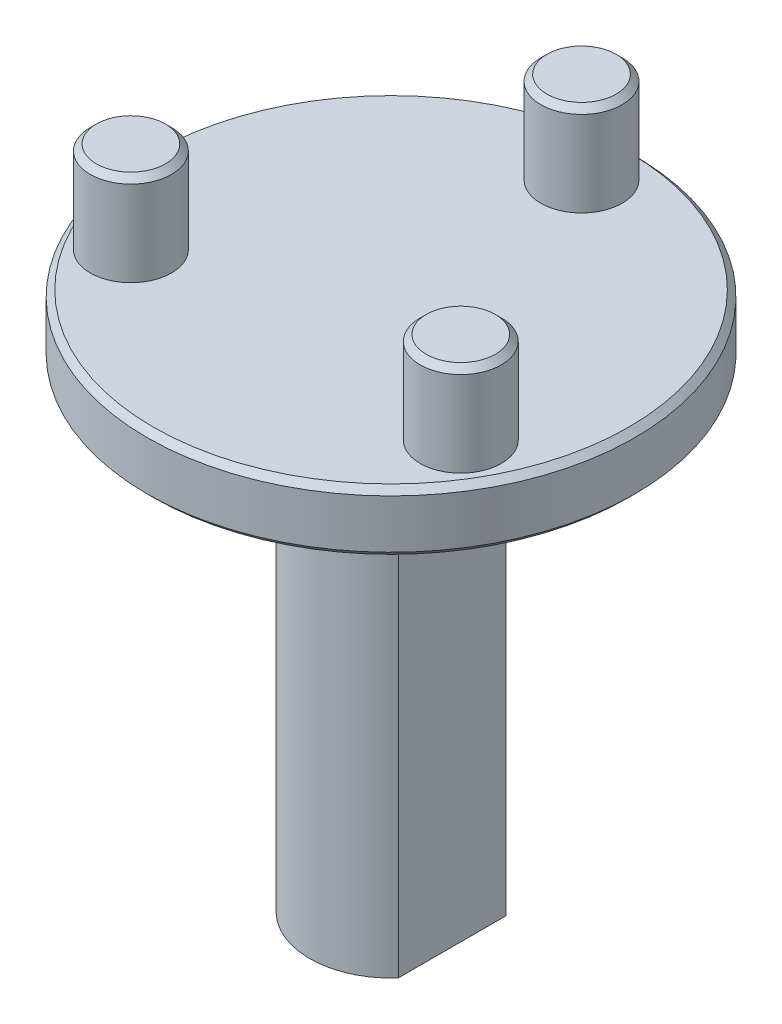
ISO-10303-21;
HEADER;
FILE_DESCRIPTION(('STEP AP214'),'2;1');
FILE_NAME('part.step','',(''),(''),'','','');
FILE_SCHEMA(('AUTOMOTIVE_DESIGN { 1 0 10303 214 1 1 1 1 }'));
ENDSEC;
DATA;
#1=APPLICATION_CONTEXT('core data for automotive mechanical design processes');
#2=APPLICATION_PROTOCOL_DEFINITION('international standard','automotive_design',2000,#1);
#3=PRODUCT_CONTEXT('',#1,'mechanical');
#4=PRODUCT('Part','Part','',(#3));
#5=PRODUCT_RELATED_PRODUCT_CATEGORY('part','',(#4));
#6=PRODUCT_DEFINITION_FORMATION('','',#4);
#7=PRODUCT_DEFINITION_CONTEXT('part definition',#1,'design');
#8=PRODUCT_DEFINITION('design','',#6,#7);
#9=PRODUCT_DEFINITION_SHAPE('','',#8);
#10=(LENGTH_UNIT() NAMED_UNIT(*) SI_UNIT(.MILLI.,.METRE.));
#11=(NAMED_UNIT(*) PLANE_ANGLE_UNIT() SI_UNIT($,.RADIAN.));
#12=(NAMED_UNIT(*) SI_UNIT($,.STERADIAN.) SOLID_ANGLE_UNIT());
#13=UNCERTAINTY_MEASURE_WITH_UNIT(LENGTH_MEASURE(1.E-05),#10,'distance_accuracy_value','');
#14=(GEOMETRIC_REPRESENTATION_CONTEXT(3) GLOBAL_UNCERTAINTY_ASSIGNED_CONTEXT((#13)) GLOBAL_UNIT_ASSIGNED_CONTEXT((#10,
#11,#12)) REPRESENTATION_CONTEXT('',''));
#15=CARTESIAN_POINT('',(0.,0.,0.));
#16=DIRECTION('',(0.,0.,1.));
#17=DIRECTION('',(1.,0.,0.));
#18=AXIS2_PLACEMENT_3D('',#15,#16,#17);
#19=CARTESIAN_POINT('',(0.,3.,0.));
#20=DIRECTION('',(0.,-1.,0.));
#21=DIRECTION('',(0.,0.,-1.));
#22=AXIS2_PLACEMENT_3D('',#19,#20,#21);
#23=CYLINDRICAL_SURFACE('',#22,12.);
#24=CARTESIAN_POINT('',(0.,0.299999999999998,0.));
#25=DIRECTION('',(0.,1.,0.));
#26=DIRECTION('',(0.,0.,1.));
#27=AXIS2_PLACEMENT_3D('',#24,#25,#26);
#28=CIRCLE('',#27,12.);
#29=CARTESIAN_POINT('',(0.,0.299999999999998,12.));
#30=VERTEX_POINT('',#29);
#31=EDGE_CURVE('E110',#30,#30,#28,.T.);
#32=ORIENTED_EDGE('',*,*,#31,.T.);
#33=EDGE_LOOP('',(#32));
#34=FACE_BOUND('',#33,.T.);
#35=CARTESIAN_POINT('',(0.,2.7,0.));
#36=DIRECTION('',(0.,1.,0.));
#37=DIRECTION('',(0.,0.,1.));
#38=AXIS2_PLACEMENT_3D('',#35,#36,#37);
#39=CIRCLE('',#38,12.);
#40=CARTESIAN_POINT('',(0.,2.7,12.));
#41=VERTEX_POINT('',#40);
#42=EDGE_CURVE('E107',#41,#41,#39,.F.);
#43=ORIENTED_EDGE('',*,*,#42,.T.);
#44=EDGE_LOOP('',(#43));
#45=FACE_BOUND('',#44,.T.);
#46=ADVANCED_FACE('F39',(#34,#45),#23,.T.);
#47=CARTESIAN_POINT('',(0.,3.,0.));
#48=DIRECTION('',(0.,1.,0.));
#49=DIRECTION('',(0.,0.,1.));
#50=AXIS2_PLACEMENT_3D('',#47,#48,#49);
#51=PLANE('',#50);
#52=CARTESIAN_POINT('',(0.,3.,0.));
#53=DIRECTION('',(0.,1.,0.));
#54=DIRECTION('',(0.,0.,1.));
#55=AXIS2_PLACEMENT_3D('',#52,#53,#54);
#56=CIRCLE('',#55,11.7);
#57=CARTESIAN_POINT('',(0.,3.,11.7));
#58=VERTEX_POINT('',#57);
#59=EDGE_CURVE('E116',#58,#58,#56,.T.);
#60=ORIENTED_EDGE('',*,*,#59,.T.);
#61=EDGE_LOOP('',(#60));
#62=FACE_BOUND('',#61,.T.);
#63=CARTESIAN_POINT('',(8.1146580334602,3.,4.68499999999998));
#64=DIRECTION('',(0.,1.,0.));
#65=DIRECTION('',(0.,0.,1.));
#66=AXIS2_PLACEMENT_3D('',#63,#64,#65);
#67=CIRCLE('',#66,2.);
#68=CARTESIAN_POINT('',(8.1146580334602,3.,6.68499999999998));
#69=VERTEX_POINT('',#68);
#70=EDGE_CURVE('E89',#69,#69,#67,.T.);
#71=ORIENTED_EDGE('',*,*,#70,.F.);
#72=EDGE_LOOP('',(#71));
#73=FACE_BOUND('',#72,.T.);
#74=CARTESIAN_POINT('',(-8.1146580334602,3.,4.68499999999998));
#75=DIRECTION('',(0.,1.,0.));
#76=DIRECTION('',(0.,0.,1.));
#77=AXIS2_PLACEMENT_3D('',#74,#75,#76);
#78=CIRCLE('',#77,2.);
#79=CARTESIAN_POINT('',(-8.1146580334602,3.,6.68499999999998));
#80=VERTEX_POINT('',#79);
#81=EDGE_CURVE('E97',#80,#80,#78,.T.);
#82=ORIENTED_EDGE('',*,*,#81,.F.);
#83=EDGE_LOOP('',(#82));
#84=FACE_BOUND('',#83,.T.);
#85=CARTESIAN_POINT('',(0.,3.,-9.37));
#86=DIRECTION('',(0.,1.,0.));
#87=DIRECTION('',(0.,0.,1.));
#88=AXIS2_PLACEMENT_3D('',#85,#86,#87);
#89=CIRCLE('',#88,2.);
#90=CARTESIAN_POINT('',(0.,3.,-7.37));
#91=VERTEX_POINT('',#90);
#92=EDGE_CURVE('E94',#91,#91,#89,.T.);
#93=ORIENTED_EDGE('',*,*,#92,.F.);
#94=EDGE_LOOP('',(#93));
#95=FACE_BOUND('',#94,.T.);
#96=ADVANCED_FACE('F139',(#62,#73,#84,#95),#51,.T.);
#97=CARTESIAN_POINT('',(0.,0.,0.));
#98=DIRECTION('',(0.,1.,0.));
#99=DIRECTION('',(0.,0.,1.));
#100=AXIS2_PLACEMENT_3D('',#97,#98,#99);
#101=PLANE('',#100);
#102=CARTESIAN_POINT('',(0.,0.,0.));
#103=DIRECTION('',(0.,1.,0.));
#104=DIRECTION('',(0.,0.,1.));
#105=AXIS2_PLACEMENT_3D('',#102,#103,#104);
#106=CIRCLE('',#105,11.7);
#107=CARTESIAN_POINT('',(0.,0.,11.7));
#108=VERTEX_POINT('',#107);
#109=EDGE_CURVE('E113',#108,#108,#106,.F.);
#110=ORIENTED_EDGE('',*,*,#109,.T.);
#111=EDGE_LOOP('',(#110));
#112=FACE_BOUND('',#111,.T.);
#113=CARTESIAN_POINT('',(0.,0.,0.));
#114=DIRECTION('',(0.,-1.,0.));
#115=DIRECTION('',(0.,0.,-1.));
#116=AXIS2_PLACEMENT_3D('',#113,#114,#115);
#117=CIRCLE('',#116,5.);
#118=CARTESIAN_POINT('',(0.,0.,-5.));
#119=VERTEX_POINT('',#118);
#120=EDGE_CURVE('E90',#119,#119,#117,.T.);
#121=ORIENTED_EDGE('',*,*,#120,.F.);
#122=EDGE_LOOP('',(#121));
#123=FACE_BOUND('',#122,.T.);
#124=ADVANCED_FACE('F145',(#112,#123),#101,.F.);
#125=CARTESIAN_POINT('',(0.,7.5,-9.37));
#126=DIRECTION('',(0.,-1.,0.));
#127=DIRECTION('',(0.,0.,-1.));
#128=AXIS2_PLACEMENT_3D('',#125,#126,#127);
#129=CYLINDRICAL_SURFACE('',#128,2.);
#130=CARTESIAN_POINT('',(0.,7.19999999999999,-9.37));
#131=DIRECTION('',(0.,1.,0.));
#132=DIRECTION('',(0.,0.,1.));
#133=AXIS2_PLACEMENT_3D('',#130,#131,#132);
#134=CIRCLE('',#133,2.);
#135=CARTESIAN_POINT('',(0.,7.19999999999999,-7.37));
#136=VERTEX_POINT('',#135);
#137=EDGE_CURVE('E122',#136,#136,#134,.F.);
#138=ORIENTED_EDGE('',*,*,#137,.T.);
#139=EDGE_LOOP('',(#138));
#140=FACE_BOUND('',#139,.T.);
#141=ORIENTED_EDGE('',*,*,#92,.T.);
#142=EDGE_LOOP('',(#141));
#143=FACE_BOUND('',#142,.T.);
#144=ADVANCED_FACE('F188',(#140,#143),#129,.T.);
#145=CARTESIAN_POINT('',(0.,7.5,-9.37));
#146=DIRECTION('',(0.,1.,0.));
#147=DIRECTION('',(0.,0.,1.));
#148=AXIS2_PLACEMENT_3D('',#145,#146,#147);
#149=PLANE('',#148);
#150=CARTESIAN_POINT('',(0.,7.5,-9.37));
#151=DIRECTION('',(0.,1.,0.));
#152=DIRECTION('',(0.,0.,1.));
#153=AXIS2_PLACEMENT_3D('',#150,#151,#152);
#154=CIRCLE('',#153,1.69999999999999);
#155=CARTESIAN_POINT('',(0.,7.5,-7.67000000000001));
#156=VERTEX_POINT('',#155);
#157=EDGE_CURVE('E119',#156,#156,#154,.T.);
#158=ORIENTED_EDGE('',*,*,#157,.T.);
#159=EDGE_LOOP('',(#158));
#160=FACE_BOUND('',#159,.T.);
#161=ADVANCED_FACE('F190',(#160),#149,.T.);
#162=CARTESIAN_POINT('',(-8.1146580334602,7.5,4.68499999999998));
#163=DIRECTION('',(0.,-1.,0.));
#164=DIRECTION('',(0.,0.,-1.));
#165=AXIS2_PLACEMENT_3D('',#162,#163,#164);
#166=CYLINDRICAL_SURFACE('',#165,2.);
#167=CARTESIAN_POINT('',(-8.1146580334602,7.2,4.68499999999998));
#168=DIRECTION('',(0.,1.,0.));
#169=DIRECTION('',(0.,0.,1.));
#170=AXIS2_PLACEMENT_3D('',#167,#168,#169);
#171=CIRCLE('',#170,2.);
#172=CARTESIAN_POINT('',(-8.1146580334602,7.2,6.68499999999998));
#173=VERTEX_POINT('',#172);
#174=EDGE_CURVE('E104',#173,#173,#171,.F.);
#175=ORIENTED_EDGE('',*,*,#174,.T.);
#176=EDGE_LOOP('',(#175));
#177=FACE_BOUND('',#176,.T.);
#178=ORIENTED_EDGE('',*,*,#81,.T.);
#179=EDGE_LOOP('',(#178));
#180=FACE_BOUND('',#179,.T.);
#181=ADVANCED_FACE('F197',(#177,#180),#166,.T.);
#182=CARTESIAN_POINT('',(-8.1146580334602,7.5,4.68499999999998));
#183=DIRECTION('',(0.,1.,0.));
#184=DIRECTION('',(0.,0.,1.));
#185=AXIS2_PLACEMENT_3D('',#182,#183,#184);
#186=PLANE('',#185);
#187=CARTESIAN_POINT('',(-8.1146580334602,7.5,4.68499999999998));
#188=DIRECTION('',(0.,1.,0.));
#189=DIRECTION('',(0.,0.,1.));
#190=AXIS2_PLACEMENT_3D('',#187,#188,#189);
#191=CIRCLE('',#190,1.70000000000001);
#192=CARTESIAN_POINT('',(-8.1146580334602,7.5,6.38499999999999));
#193=VERTEX_POINT('',#192);
#194=EDGE_CURVE('E93',#193,#193,#191,.T.);
#195=ORIENTED_EDGE('',*,*,#194,.T.);
#196=EDGE_LOOP('',(#195));
#197=FACE_BOUND('',#196,.T.);
#198=ADVANCED_FACE('F202',(#197),#186,.T.);
#199=CARTESIAN_POINT('',(8.1146580334602,7.5,4.68499999999998));
#200=DIRECTION('',(0.,-1.,0.));
#201=DIRECTION('',(0.,0.,-1.));
#202=AXIS2_PLACEMENT_3D('',#199,#200,#201);
#203=CYLINDRICAL_SURFACE('',#202,2.);
#204=CARTESIAN_POINT('',(8.1146580334602,7.2,4.68499999999998));
#205=DIRECTION('',(0.,1.,0.));
#206=DIRECTION('',(0.,0.,1.));
#207=AXIS2_PLACEMENT_3D('',#204,#205,#206);
#208=CIRCLE('',#207,2.);
#209=CARTESIAN_POINT('',(8.1146580334602,7.2,6.68499999999998));
#210=VERTEX_POINT('',#209);
#211=EDGE_CURVE('E11',#210,#210,#208,.F.);
#212=ORIENTED_EDGE('',*,*,#211,.T.);
#213=EDGE_LOOP('',(#212));
#214=FACE_BOUND('',#213,.T.);
#215=ORIENTED_EDGE('',*,*,#70,.T.);
#216=EDGE_LOOP('',(#215));
#217=FACE_BOUND('',#216,.T.);
#218=ADVANCED_FACE('F205',(#214,#217),#203,.T.);
#219=CARTESIAN_POINT('',(8.1146580334602,7.5,4.68499999999998));
#220=DIRECTION('',(0.,1.,0.));
#221=DIRECTION('',(0.,0.,1.));
#222=AXIS2_PLACEMENT_3D('',#219,#220,#221);
#223=PLANE('',#222);
#224=CARTESIAN_POINT('',(8.1146580334602,7.5,4.68499999999998));
#225=DIRECTION('',(0.,1.,0.));
#226=DIRECTION('',(0.,0.,1.));
#227=AXIS2_PLACEMENT_3D('',#224,#225,#226);
#228=CIRCLE('',#227,1.70000000000001);
#229=CARTESIAN_POINT('',(8.1146580334602,7.5,6.38499999999999));
#230=VERTEX_POINT('',#229);
#231=EDGE_CURVE('E48',#230,#230,#228,.T.);
#232=ORIENTED_EDGE('',*,*,#231,.T.);
#233=EDGE_LOOP('',(#232));
#234=FACE_BOUND('',#233,.T.);
#235=ADVANCED_FACE('F127',(#234),#223,.T.);
#236=CARTESIAN_POINT('',(0.,-1.,0.));
#237=DIRECTION('',(0.,1.,0.));
#238=DIRECTION('',(0.,0.,1.));
#239=AXIS2_PLACEMENT_3D('',#236,#237,#238);
#240=CYLINDRICAL_SURFACE('',#239,5.);
#241=CARTESIAN_POINT('',(0.,-1.,0.));
#242=DIRECTION('',(0.,-1.,0.));
#243=DIRECTION('',(0.,0.,-1.));
#244=AXIS2_PLACEMENT_3D('',#241,#242,#243);
#245=CIRCLE('',#244,5.);
#246=CARTESIAN_POINT('',(0.,-1.,-5.));
#247=VERTEX_POINT('',#246);
#248=EDGE_CURVE('E83',#247,#247,#245,.T.);
#249=ORIENTED_EDGE('',*,*,#248,.F.);
#250=EDGE_LOOP('',(#249));
#251=FACE_BOUND('',#250,.T.);
#252=ORIENTED_EDGE('',*,*,#120,.T.);
#253=EDGE_LOOP('',(#252));
#254=FACE_BOUND('',#253,.T.);
#255=ADVANCED_FACE('F212',(#251,#254),#240,.T.);
#256=CARTESIAN_POINT('',(0.,-1.,0.));
#257=DIRECTION('',(0.,-1.,0.));
#258=DIRECTION('',(0.,0.,-1.));
#259=AXIS2_PLACEMENT_3D('',#256,#257,#258);
#260=PLANE('',#259);
#261=CARTESIAN_POINT('',(0.,-1.,0.));
#262=DIRECTION('',(0.,-1.,0.));
#263=DIRECTION('',(0.,0.,-1.));
#264=AXIS2_PLACEMENT_3D('',#261,#262,#263);
#265=CIRCLE('',#264,4.);
#266=CARTESIAN_POINT('',(3.,-1.,2.64575131106459));
#267=VERTEX_POINT('',#266);
#268=CARTESIAN_POINT('',(3.,-1.,-2.64575131106459));
#269=VERTEX_POINT('',#268);
#270=EDGE_CURVE('E67',#267,#269,#265,.T.);
#271=ORIENTED_EDGE('',*,*,#270,.F.);
#272=DIRECTION('',(0.,0.,1.));
#273=VECTOR('',#272,1.);
#274=CARTESIAN_POINT('',(3.,-1.,2.64575131106459));
#275=LINE('',#274,#273);
#276=EDGE_CURVE('E54',#269,#267,#275,.T.);
#277=ORIENTED_EDGE('',*,*,#276,.F.);
#278=EDGE_LOOP('',(#271,#277));
#279=FACE_BOUND('',#278,.T.);
#280=ORIENTED_EDGE('',*,*,#248,.T.);
#281=EDGE_LOOP('',(#280));
#282=FACE_BOUND('',#281,.T.);
#283=ADVANCED_FACE('F68',(#279,#282),#260,.T.);
#284=CARTESIAN_POINT('',(0.,-23.5,0.));
#285=DIRECTION('',(0.,1.,0.));
#286=DIRECTION('',(0.,0.,1.));
#287=AXIS2_PLACEMENT_3D('',#284,#285,#286);
#288=CYLINDRICAL_SURFACE('',#287,4.);
#289=ORIENTED_EDGE('',*,*,#270,.T.);
#290=DIRECTION('',(0.,1.,0.));
#291=VECTOR('',#290,1.);
#292=CARTESIAN_POINT('',(3.,-23.5,-2.64575131106459));
#293=LINE('',#292,#291);
#294=CARTESIAN_POINT('',(3.,-23.5,-2.64575131106459));
#295=VERTEX_POINT('',#294);
#296=EDGE_CURVE('E78',#295,#269,#293,.T.);
#297=ORIENTED_EDGE('',*,*,#296,.F.);
#298=CARTESIAN_POINT('',(0.,-23.5,0.));
#299=DIRECTION('',(0.,-1.,0.));
#300=DIRECTION('',(0.,0.,-1.));
#301=AXIS2_PLACEMENT_3D('',#298,#299,#300);
#302=CIRCLE('',#301,4.);
#303=CARTESIAN_POINT('',(3.,-23.5,2.64575131106459));
#304=VERTEX_POINT('',#303);
#305=EDGE_CURVE('E79',#304,#295,#302,.T.);
#306=ORIENTED_EDGE('',*,*,#305,.F.);
#307=DIRECTION('',(0.,1.,0.));
#308=VECTOR('',#307,1.);
#309=CARTESIAN_POINT('',(3.,-23.5,2.64575131106459));
#310=LINE('',#309,#308);
#311=EDGE_CURVE('E76',#304,#267,#310,.T.);
#312=ORIENTED_EDGE('',*,*,#311,.T.);
#313=EDGE_LOOP('',(#289,#297,#306,#312));
#314=FACE_BOUND('',#313,.T.);
#315=ADVANCED_FACE('F81',(#314),#288,.T.);
#316=CARTESIAN_POINT('',(3.,-23.5,2.64575131106459));
#317=DIRECTION('',(-1.,0.,0.));
#318=DIRECTION('',(0.,0.,1.));
#319=AXIS2_PLACEMENT_3D('',#316,#317,#318);
#320=PLANE('',#319);
#321=ORIENTED_EDGE('',*,*,#276,.T.);
#322=ORIENTED_EDGE('',*,*,#311,.F.);
#323=DIRECTION('',(0.,0.,1.));
#324=VECTOR('',#323,1.);
#325=CARTESIAN_POINT('',(3.,-23.5,2.64575131106459));
#326=LINE('',#325,#324);
#327=EDGE_CURVE('E62',#295,#304,#326,.T.);
#328=ORIENTED_EDGE('',*,*,#327,.F.);
#329=ORIENTED_EDGE('',*,*,#296,.T.);
#330=EDGE_LOOP('',(#321,#322,#328,#329));
#331=FACE_BOUND('',#330,.T.);
#332=ADVANCED_FACE('F75',(#331),#320,.F.);
#333=CARTESIAN_POINT('',(0.,-23.5,0.));
#334=DIRECTION('',(0.,-1.,0.));
#335=DIRECTION('',(0.,0.,-1.));
#336=AXIS2_PLACEMENT_3D('',#333,#334,#335);
#337=PLANE('',#336);
#338=ORIENTED_EDGE('',*,*,#305,.T.);
#339=ORIENTED_EDGE('',*,*,#327,.T.);
#340=EDGE_LOOP('',(#338,#339));
#341=FACE_BOUND('',#340,.T.);
#342=ADVANCED_FACE('F159',(#341),#337,.T.);
#343=CARTESIAN_POINT('',(-8.1146580334602,7.5,4.68499999999998));
#344=DIRECTION('',(0.,-1.,0.));
#345=DIRECTION('',(0.,0.,-1.));
#346=AXIS2_PLACEMENT_3D('',#343,#344,#345);
#347=CONICAL_SURFACE('',#346,1.70000000000001,0.78539816339744);
#348=ORIENTED_EDGE('',*,*,#174,.F.);
#349=EDGE_LOOP('',(#348));
#350=FACE_BOUND('',#349,.T.);
#351=ORIENTED_EDGE('',*,*,#194,.F.);
#352=EDGE_LOOP('',(#351));
#353=FACE_BOUND('',#352,.T.);
#354=ADVANCED_FACE('F152',(#350,#353),#347,.T.);
#355=CARTESIAN_POINT('',(0.,0.299999999999998,0.));
#356=DIRECTION('',(0.,1.,0.));
#357=DIRECTION('',(0.,0.,1.));
#358=AXIS2_PLACEMENT_3D('',#355,#356,#357);
#359=CONICAL_SURFACE('',#358,12.,0.785398163397448);
#360=ORIENTED_EDGE('',*,*,#109,.F.);
#361=EDGE_LOOP('',(#360));
#362=FACE_BOUND('',#361,.T.);
#363=ORIENTED_EDGE('',*,*,#31,.F.);
#364=EDGE_LOOP('',(#363));
#365=FACE_BOUND('',#364,.T.);
#366=ADVANCED_FACE('F158',(#362,#365),#359,.T.);
#367=CARTESIAN_POINT('',(0.,3.,0.));
#368=DIRECTION('',(0.,-1.,0.));
#369=DIRECTION('',(0.,0.,-1.));
#370=AXIS2_PLACEMENT_3D('',#367,#368,#369);
#371=CONICAL_SURFACE('',#370,11.7,0.785398163397445);
#372=ORIENTED_EDGE('',*,*,#42,.F.);
#373=EDGE_LOOP('',(#372));
#374=FACE_BOUND('',#373,.T.);
#375=ORIENTED_EDGE('',*,*,#59,.F.);
#376=EDGE_LOOP('',(#375));
#377=FACE_BOUND('',#376,.T.);
#378=ADVANCED_FACE('F135',(#374,#377),#371,.T.);
#379=CARTESIAN_POINT('',(0.,7.5,-9.37));
#380=DIRECTION('',(0.,-1.,0.));
#381=DIRECTION('',(0.,0.,-1.));
#382=AXIS2_PLACEMENT_3D('',#379,#380,#381);
#383=CONICAL_SURFACE('',#382,1.69999999999999,0.785398163397445);
#384=ORIENTED_EDGE('',*,*,#137,.F.);
#385=EDGE_LOOP('',(#384));
#386=FACE_BOUND('',#385,.T.);
#387=ORIENTED_EDGE('',*,*,#157,.F.);
#388=EDGE_LOOP('',(#387));
#389=FACE_BOUND('',#388,.T.);
#390=ADVANCED_FACE('F130',(#386,#389),#383,.T.);
#391=CARTESIAN_POINT('',(8.1146580334602,7.5,4.68499999999998));
#392=DIRECTION('',(0.,-1.,0.));
#393=DIRECTION('',(0.,0.,-1.));
#394=AXIS2_PLACEMENT_3D('',#391,#392,#393);
#395=CONICAL_SURFACE('',#394,1.70000000000001,0.785398163397442);
#396=ORIENTED_EDGE('',*,*,#211,.F.);
#397=EDGE_LOOP('',(#396));
#398=FACE_BOUND('',#397,.T.);
#399=ORIENTED_EDGE('',*,*,#231,.F.);
#400=EDGE_LOOP('',(#399));
#401=FACE_BOUND('',#400,.T.);
#402=ADVANCED_FACE('F42',(#398,#401),#395,.T.);
#403=CLOSED_SHELL('',(#46,#96,#124,#144,#161,#181,#198,#218,#235,#255,#283,#315,#332,#342,#354,
#366,#378,#390,#402));
#404=MANIFOLD_SOLID_BREP('B2',#403);
#405=ADVANCED_BREP_SHAPE_REPRESENTATION('',(#18,#404),#14);
#406=SHAPE_DEFINITION_REPRESENTATION(#9,#405);
ENDSEC;
END-ISO-10303-21;
